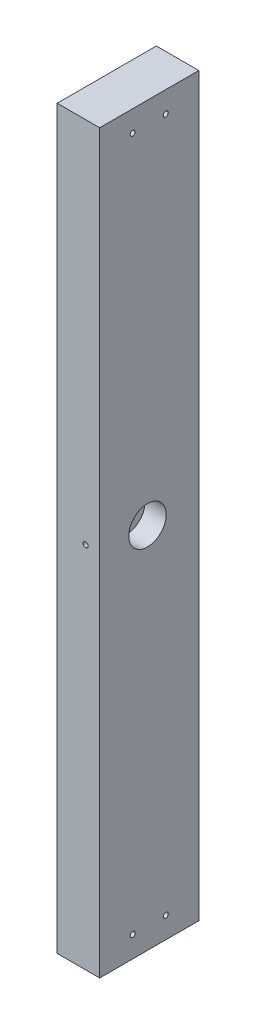
ISO-10303-21;
HEADER;
FILE_DESCRIPTION(('STEP AP214'),'2;1');
FILE_NAME('part.step','',(''),(''),'','','');
FILE_SCHEMA(('AUTOMOTIVE_DESIGN { 1 0 10303 214 1 1 1 1 }'));
ENDSEC;
DATA;
#1=APPLICATION_CONTEXT('core data for automotive mechanical design processes');
#2=APPLICATION_PROTOCOL_DEFINITION('international standard','automotive_design',2000,#1);
#3=PRODUCT_CONTEXT('',#1,'mechanical');
#4=PRODUCT('Part','Part','',(#3));
#5=PRODUCT_RELATED_PRODUCT_CATEGORY('part','',(#4));
#6=PRODUCT_DEFINITION_FORMATION('','',#4);
#7=PRODUCT_DEFINITION_CONTEXT('part definition',#1,'design');
#8=PRODUCT_DEFINITION('design','',#6,#7);
#9=PRODUCT_DEFINITION_SHAPE('','',#8);
#10=(LENGTH_UNIT() NAMED_UNIT(*) SI_UNIT(.MILLI.,.METRE.));
#11=(NAMED_UNIT(*) PLANE_ANGLE_UNIT() SI_UNIT($,.RADIAN.));
#12=(NAMED_UNIT(*) SI_UNIT($,.STERADIAN.) SOLID_ANGLE_UNIT());
#13=UNCERTAINTY_MEASURE_WITH_UNIT(LENGTH_MEASURE(1.E-05),#10,'distance_accuracy_value','');
#14=(GEOMETRIC_REPRESENTATION_CONTEXT(3) GLOBAL_UNCERTAINTY_ASSIGNED_CONTEXT((#13)) GLOBAL_UNIT_ASSIGNED_CONTEXT((#10,
#11,#12)) REPRESENTATION_CONTEXT('',''));
#15=CARTESIAN_POINT('',(0.,0.,0.));
#16=DIRECTION('',(0.,0.,1.));
#17=DIRECTION('',(1.,0.,0.));
#18=AXIS2_PLACEMENT_3D('',#15,#16,#17);
#19=CARTESIAN_POINT('',(0.,660.4,0.));
#20=DIRECTION('',(1.,0.,0.));
#21=DIRECTION('',(0.,0.,-1.));
#22=AXIS2_PLACEMENT_3D('',#19,#20,#21);
#23=PLANE('',#22);
#24=CARTESIAN_POINT('',(0.,19.05,-29.6333333333333));
#25=DIRECTION('',(1.,0.,0.));
#26=DIRECTION('',(0.,0.,-1.));
#27=AXIS2_PLACEMENT_3D('',#24,#25,#26);
#28=CIRCLE('',#27,2.2479);
#29=CARTESIAN_POINT('',(0.,19.05,-31.8812333333333));
#30=VERTEX_POINT('',#29);
#31=EDGE_CURVE('E160',#30,#30,#28,.T.);
#32=ORIENTED_EDGE('',*,*,#31,.T.);
#33=EDGE_LOOP('',(#32));
#34=FACE_BOUND('',#33,.T.);
#35=CARTESIAN_POINT('',(0.,641.35,-59.2666666666667));
#36=DIRECTION('',(1.,0.,0.));
#37=DIRECTION('',(0.,0.,-1.));
#38=AXIS2_PLACEMENT_3D('',#35,#36,#37);
#39=CIRCLE('',#38,2.24790000000002);
#40=CARTESIAN_POINT('',(0.,641.35,-61.5145666666667));
#41=VERTEX_POINT('',#40);
#42=EDGE_CURVE('E164',#41,#41,#39,.T.);
#43=ORIENTED_EDGE('',*,*,#42,.T.);
#44=EDGE_LOOP('',(#43));
#45=FACE_BOUND('',#44,.T.);
#46=CARTESIAN_POINT('',(0.,641.35,-29.6333333333333));
#47=DIRECTION('',(1.,0.,0.));
#48=DIRECTION('',(0.,0.,-1.));
#49=AXIS2_PLACEMENT_3D('',#46,#47,#48);
#50=CIRCLE('',#49,2.24790000000002);
#51=CARTESIAN_POINT('',(0.,641.35,-31.8812333333334));
#52=VERTEX_POINT('',#51);
#53=EDGE_CURVE('E167',#52,#52,#50,.T.);
#54=ORIENTED_EDGE('',*,*,#53,.T.);
#55=EDGE_LOOP('',(#54));
#56=FACE_BOUND('',#55,.T.);
#57=CARTESIAN_POINT('',(0.,19.05,-59.2666666666667));
#58=DIRECTION('',(1.,0.,0.));
#59=DIRECTION('',(0.,0.,-1.));
#60=AXIS2_PLACEMENT_3D('',#57,#58,#59);
#61=CIRCLE('',#60,2.2479);
#62=CARTESIAN_POINT('',(0.,19.05,-61.5145666666667));
#63=VERTEX_POINT('',#62);
#64=EDGE_CURVE('E170',#63,#63,#61,.T.);
#65=ORIENTED_EDGE('',*,*,#64,.T.);
#66=EDGE_LOOP('',(#65));
#67=FACE_BOUND('',#66,.T.);
#68=DIRECTION('',(0.,0.,1.));
#69=VECTOR('',#68,1.);
#70=CARTESIAN_POINT('',(0.,0.,0.));
#71=LINE('',#70,#69);
#72=CARTESIAN_POINT('',(0.,0.,-88.9));
#73=VERTEX_POINT('',#72);
#74=CARTESIAN_POINT('',(0.,0.,0.));
#75=VERTEX_POINT('',#74);
#76=EDGE_CURVE('E96',#73,#75,#71,.T.);
#77=ORIENTED_EDGE('',*,*,#76,.T.);
#78=DIRECTION('',(0.,-1.,0.));
#79=VECTOR('',#78,1.);
#80=CARTESIAN_POINT('',(0.,660.4,0.));
#81=LINE('',#80,#79);
#82=CARTESIAN_POINT('',(0.,660.4,0.));
#83=VERTEX_POINT('',#82);
#84=EDGE_CURVE('E11',#83,#75,#81,.T.);
#85=ORIENTED_EDGE('',*,*,#84,.F.);
#86=DIRECTION('',(0.,0.,1.));
#87=VECTOR('',#86,1.);
#88=CARTESIAN_POINT('',(0.,660.4,0.));
#89=LINE('',#88,#87);
#90=CARTESIAN_POINT('',(0.,660.4,-88.9));
#91=VERTEX_POINT('',#90);
#92=EDGE_CURVE('E84',#91,#83,#89,.T.);
#93=ORIENTED_EDGE('',*,*,#92,.F.);
#94=DIRECTION('',(0.,-1.,0.));
#95=VECTOR('',#94,1.);
#96=CARTESIAN_POINT('',(0.,660.4,-88.9));
#97=LINE('',#96,#95);
#98=EDGE_CURVE('E92',#91,#73,#97,.T.);
#99=ORIENTED_EDGE('',*,*,#98,.T.);
#100=EDGE_LOOP('',(#77,#85,#93,#99));
#101=FACE_BOUND('',#100,.T.);
#102=ADVANCED_FACE('F33',(#34,#45,#56,#67,#101),#23,.F.);
#103=CARTESIAN_POINT('',(0.,660.4,0.));
#104=DIRECTION('',(0.,0.,-1.));
#105=DIRECTION('',(-1.,0.,0.));
#106=AXIS2_PLACEMENT_3D('',#103,#104,#105);
#107=PLANE('',#106);
#108=CARTESIAN_POINT('',(25.4,330.2,0.));
#109=DIRECTION('',(0.,0.,1.));
#110=DIRECTION('',(1.,0.,0.));
#111=AXIS2_PLACEMENT_3D('',#108,#109,#110);
#112=CIRCLE('',#111,2.24789999999999);
#113=CARTESIAN_POINT('',(27.6479,330.2,0.));
#114=VERTEX_POINT('',#113);
#115=EDGE_CURVE('E123',#114,#114,#112,.T.);
#116=ORIENTED_EDGE('',*,*,#115,.F.);
#117=EDGE_LOOP('',(#116));
#118=FACE_BOUND('',#117,.T.);
#119=DIRECTION('',(1.,0.,0.));
#120=VECTOR('',#119,1.);
#121=CARTESIAN_POINT('',(0.,0.,0.));
#122=LINE('',#121,#120);
#123=CARTESIAN_POINT('',(38.1,0.,0.));
#124=VERTEX_POINT('',#123);
#125=EDGE_CURVE('E88',#75,#124,#122,.T.);
#126=ORIENTED_EDGE('',*,*,#125,.T.);
#127=DIRECTION('',(0.,-1.,0.));
#128=VECTOR('',#127,1.);
#129=CARTESIAN_POINT('',(38.1,660.4,0.));
#130=LINE('',#129,#128);
#131=CARTESIAN_POINT('',(38.1,660.4,0.));
#132=VERTEX_POINT('',#131);
#133=EDGE_CURVE('E41',#132,#124,#130,.T.);
#134=ORIENTED_EDGE('',*,*,#133,.F.);
#135=DIRECTION('',(1.,0.,0.));
#136=VECTOR('',#135,1.);
#137=CARTESIAN_POINT('',(0.,660.4,0.));
#138=LINE('',#137,#136);
#139=EDGE_CURVE('E79',#83,#132,#138,.T.);
#140=ORIENTED_EDGE('',*,*,#139,.F.);
#141=ORIENTED_EDGE('',*,*,#84,.T.);
#142=EDGE_LOOP('',(#126,#134,#140,#141));
#143=FACE_BOUND('',#142,.T.);
#144=ADVANCED_FACE('F87',(#118,#143),#107,.F.);
#145=CARTESIAN_POINT('',(38.1,660.4,0.));
#146=DIRECTION('',(-1.,0.,0.));
#147=DIRECTION('',(0.,0.,1.));
#148=AXIS2_PLACEMENT_3D('',#145,#146,#147);
#149=PLANE('',#148);
#150=CARTESIAN_POINT('',(38.1,19.05,-29.6333333333333));
#151=DIRECTION('',(1.,0.,0.));
#152=DIRECTION('',(0.,0.,-1.));
#153=AXIS2_PLACEMENT_3D('',#150,#151,#152);
#154=CIRCLE('',#153,2.2479);
#155=CARTESIAN_POINT('',(38.1,19.05,-31.8812333333333));
#156=VERTEX_POINT('',#155);
#157=EDGE_CURVE('E180',#156,#156,#154,.T.);
#158=ORIENTED_EDGE('',*,*,#157,.F.);
#159=EDGE_LOOP('',(#158));
#160=FACE_BOUND('',#159,.T.);
#161=CARTESIAN_POINT('',(38.1,641.35,-59.2666666666667));
#162=DIRECTION('',(1.,0.,0.));
#163=DIRECTION('',(0.,0.,-1.));
#164=AXIS2_PLACEMENT_3D('',#161,#162,#163);
#165=CIRCLE('',#164,2.24790000000002);
#166=CARTESIAN_POINT('',(38.1,641.35,-61.5145666666667));
#167=VERTEX_POINT('',#166);
#168=EDGE_CURVE('E176',#167,#167,#165,.T.);
#169=ORIENTED_EDGE('',*,*,#168,.F.);
#170=EDGE_LOOP('',(#169));
#171=FACE_BOUND('',#170,.T.);
#172=CARTESIAN_POINT('',(38.1,641.35,-29.6333333333333));
#173=DIRECTION('',(1.,0.,0.));
#174=DIRECTION('',(0.,0.,-1.));
#175=AXIS2_PLACEMENT_3D('',#172,#173,#174);
#176=CIRCLE('',#175,2.24790000000002);
#177=CARTESIAN_POINT('',(38.1,641.35,-31.8812333333334));
#178=VERTEX_POINT('',#177);
#179=EDGE_CURVE('E184',#178,#178,#176,.T.);
#180=ORIENTED_EDGE('',*,*,#179,.F.);
#181=EDGE_LOOP('',(#180));
#182=FACE_BOUND('',#181,.T.);
#183=CARTESIAN_POINT('',(38.1,19.05,-59.2666666666667));
#184=DIRECTION('',(1.,0.,0.));
#185=DIRECTION('',(0.,0.,-1.));
#186=AXIS2_PLACEMENT_3D('',#183,#184,#185);
#187=CIRCLE('',#186,2.2479);
#188=CARTESIAN_POINT('',(38.1,19.05,-61.5145666666667));
#189=VERTEX_POINT('',#188);
#190=EDGE_CURVE('E171',#189,#189,#187,.T.);
#191=ORIENTED_EDGE('',*,*,#190,.F.);
#192=EDGE_LOOP('',(#191));
#193=FACE_BOUND('',#192,.T.);
#194=CARTESIAN_POINT('',(38.1,330.2,-42.8752));
#195=DIRECTION('',(1.,0.,0.));
#196=DIRECTION('',(0.,0.,-1.));
#197=AXIS2_PLACEMENT_3D('',#194,#195,#196);
#198=CIRCLE('',#197,16.8275);
#199=CARTESIAN_POINT('',(38.1,330.2,-59.7027));
#200=VERTEX_POINT('',#199);
#201=EDGE_CURVE('E110',#200,#200,#198,.T.);
#202=ORIENTED_EDGE('',*,*,#201,.F.);
#203=EDGE_LOOP('',(#202));
#204=FACE_BOUND('',#203,.T.);
#205=DIRECTION('',(0.,0.,-1.));
#206=VECTOR('',#205,1.);
#207=CARTESIAN_POINT('',(38.1,0.,0.));
#208=LINE('',#207,#206);
#209=CARTESIAN_POINT('',(38.1,0.,-88.9));
#210=VERTEX_POINT('',#209);
#211=EDGE_CURVE('E66',#124,#210,#208,.T.);
#212=ORIENTED_EDGE('',*,*,#211,.T.);
#213=DIRECTION('',(0.,-1.,0.));
#214=VECTOR('',#213,1.);
#215=CARTESIAN_POINT('',(38.1,660.4,-88.9));
#216=LINE('',#215,#214);
#217=CARTESIAN_POINT('',(38.1,660.4,-88.9));
#218=VERTEX_POINT('',#217);
#219=EDGE_CURVE('E89',#218,#210,#216,.T.);
#220=ORIENTED_EDGE('',*,*,#219,.F.);
#221=DIRECTION('',(0.,0.,-1.));
#222=VECTOR('',#221,1.);
#223=CARTESIAN_POINT('',(38.1,660.4,0.));
#224=LINE('',#223,#222);
#225=EDGE_CURVE('E82',#132,#218,#224,.T.);
#226=ORIENTED_EDGE('',*,*,#225,.F.);
#227=ORIENTED_EDGE('',*,*,#133,.T.);
#228=EDGE_LOOP('',(#212,#220,#226,#227));
#229=FACE_BOUND('',#228,.T.);
#230=ADVANCED_FACE('F90',(#160,#171,#182,#193,#204,#229),#149,.F.);
#231=CARTESIAN_POINT('',(0.,660.4,-88.9));
#232=DIRECTION('',(0.,0.,1.));
#233=DIRECTION('',(1.,0.,0.));
#234=AXIS2_PLACEMENT_3D('',#231,#232,#233);
#235=PLANE('',#234);
#236=DIRECTION('',(-1.,0.,0.));
#237=VECTOR('',#236,1.);
#238=CARTESIAN_POINT('',(0.,0.,-88.9));
#239=LINE('',#238,#237);
#240=EDGE_CURVE('E72',#210,#73,#239,.T.);
#241=ORIENTED_EDGE('',*,*,#240,.T.);
#242=ORIENTED_EDGE('',*,*,#98,.F.);
#243=DIRECTION('',(-1.,0.,0.));
#244=VECTOR('',#243,1.);
#245=CARTESIAN_POINT('',(0.,660.4,-88.9));
#246=LINE('',#245,#244);
#247=EDGE_CURVE('E49',#218,#91,#246,.T.);
#248=ORIENTED_EDGE('',*,*,#247,.F.);
#249=ORIENTED_EDGE('',*,*,#219,.T.);
#250=EDGE_LOOP('',(#241,#242,#248,#249));
#251=FACE_BOUND('',#250,.T.);
#252=ADVANCED_FACE('F104',(#251),#235,.F.);
#253=CARTESIAN_POINT('',(0.,660.4,0.));
#254=DIRECTION('',(0.,-1.,0.));
#255=DIRECTION('',(0.,0.,-1.));
#256=AXIS2_PLACEMENT_3D('',#253,#254,#255);
#257=PLANE('',#256);
#258=ORIENTED_EDGE('',*,*,#92,.T.);
#259=ORIENTED_EDGE('',*,*,#139,.T.);
#260=ORIENTED_EDGE('',*,*,#225,.T.);
#261=ORIENTED_EDGE('',*,*,#247,.T.);
#262=EDGE_LOOP('',(#258,#259,#260,#261));
#263=FACE_BOUND('',#262,.T.);
#264=ADVANCED_FACE('F80',(#263),#257,.F.);
#265=CARTESIAN_POINT('',(0.,0.,0.));
#266=DIRECTION('',(0.,-1.,0.));
#267=DIRECTION('',(0.,0.,-1.));
#268=AXIS2_PLACEMENT_3D('',#265,#266,#267);
#269=PLANE('',#268);
#270=ORIENTED_EDGE('',*,*,#76,.F.);
#271=ORIENTED_EDGE('',*,*,#240,.F.);
#272=ORIENTED_EDGE('',*,*,#211,.F.);
#273=ORIENTED_EDGE('',*,*,#125,.F.);
#274=EDGE_LOOP('',(#270,#271,#272,#273));
#275=FACE_BOUND('',#274,.T.);
#276=ADVANCED_FACE('F107',(#275),#269,.T.);
#277=CARTESIAN_POINT('',(19.05,330.2,-42.8752));
#278=DIRECTION('',(1.,0.,0.));
#279=DIRECTION('',(0.,0.,-1.));
#280=AXIS2_PLACEMENT_3D('',#277,#278,#279);
#281=CYLINDRICAL_SURFACE('',#280,16.8275);
#282=CARTESIAN_POINT('',(27.6479,330.2,-26.0477));
#283=CARTESIAN_POINT('',(27.647894708086,330.074334702401,-26.0477018488571));
#284=CARTESIAN_POINT('',(27.6373267747194,329.948592686172,-26.0491225049798));
#285=CARTESIAN_POINT('',(27.5953389178805,329.700612703813,-26.0546531095101));
#286=CARTESIAN_POINT('',(27.5638976961229,329.578378449901,-26.0587658047087));
#287=CARTESIAN_POINT('',(27.4811104864274,329.341039507401,-26.0692175388866));
#288=CARTESIAN_POINT('',(27.4297784321602,329.225929893267,-26.0755550190965));
#289=CARTESIAN_POINT('',(27.3086983666944,329.005979208235,-26.0897529481188));
#290=CARTESIAN_POINT('',(27.2389533188103,328.901136488741,-26.0976131518161));
#291=CARTESIAN_POINT('',(27.0825613685094,328.704019610955,-26.1140350369292));
#292=CARTESIAN_POINT('',(26.995822229138,328.611818931648,-26.1226003915145));
#293=CARTESIAN_POINT('',(26.8081025448129,328.443236585622,-26.1394378775228));
#294=CARTESIAN_POINT('',(26.7071212456335,328.366855757208,-26.1477099933875));
#295=CARTESIAN_POINT('',(26.4933006930738,328.23180337628,-26.1630603313318));
#296=CARTESIAN_POINT('',(26.3804171065492,328.173201428677,-26.1701338142338));
#297=CARTESIAN_POINT('',(26.1463000803922,328.075814905193,-26.1822369082248));
#298=CARTESIAN_POINT('',(26.0250670019291,328.03702947273,-26.1872666076557));
#299=CARTESIAN_POINT('',(25.7784586052856,327.980601924696,-26.1946771745399));
#300=CARTESIAN_POINT('',(25.6531122942284,327.96283512463,-26.1970736563835));
#301=CARTESIAN_POINT('',(25.401196101719,327.948563213396,-26.1989940889242));
#302=CARTESIAN_POINT('',(25.2746262765052,327.952057129584,-26.1985181710293));
#303=CARTESIAN_POINT('',(25.02472865646,327.980105270609,-26.1947618652881));
#304=CARTESIAN_POINT('',(24.9013850761518,328.004521662238,-26.1914998322861));
#305=CARTESIAN_POINT('',(24.6605616012565,328.073506379214,-26.1825674839979));
#306=CARTESIAN_POINT('',(24.5430818408948,328.118075165624,-26.1768971136122));
#307=CARTESIAN_POINT('',(24.3168954888118,328.226246119556,-26.163766354997));
#308=CARTESIAN_POINT('',(24.2082176435913,328.289907692213,-26.1563003945585));
#309=CARTESIAN_POINT('',(24.003035261181,328.434414667252,-26.1404238897124));
#310=CARTESIAN_POINT('',(23.9065313597689,328.515260966506,-26.1320132960151));
#311=CARTESIAN_POINT('',(23.7276366078709,328.692603987633,-26.1151137437882));
#312=CARTESIAN_POINT('',(23.6453634006657,328.789219419285,-26.1066246915262));
#313=CARTESIAN_POINT('',(23.498183127106,328.994950761053,-26.0905867958908));
#314=CARTESIAN_POINT('',(23.4332761111077,329.104066707416,-26.0830379552438));
#315=CARTESIAN_POINT('',(23.3226686867871,329.331796035648,-26.0697253745184));
#316=CARTESIAN_POINT('',(23.2769761970255,329.450413309214,-26.0639623706641));
#317=CARTESIAN_POINT('',(23.206191119075,329.693731118106,-26.0548772762367));
#318=CARTESIAN_POINT('',(23.1810974284996,329.818431327513,-26.0515550550412));
#319=CARTESIAN_POINT('',(23.1523760197451,330.069358632849,-26.0477429298664));
#320=CARTESIAN_POINT('',(23.1485863483327,330.195566879332,-26.0472316576987));
#321=CARTESIAN_POINT('',(23.162152354956,330.44681845414,-26.0490411904918));
#322=CARTESIAN_POINT('',(23.1795075170717,330.571861810814,-26.0513619263534));
#323=CARTESIAN_POINT('',(23.2347359486478,330.816752106373,-26.0585614471018));
#324=CARTESIAN_POINT('',(23.2725314517975,330.93661689279,-26.063430534407));
#325=CARTESIAN_POINT('',(23.3674864655866,331.168307361374,-26.0751819753137));
#326=CARTESIAN_POINT('',(23.4246467175661,331.28013273557,-26.0820644059906));
#327=CARTESIAN_POINT('',(23.5570966429949,331.493289774734,-26.0971293130405));
#328=CARTESIAN_POINT('',(23.6324904241232,331.594556220012,-26.1053191596169));
#329=CARTESIAN_POINT('',(23.7991207351567,331.783055953834,-26.1220611262931));
#330=CARTESIAN_POINT('',(23.8903579871275,331.870288602441,-26.1306132628907));
#331=CARTESIAN_POINT('',(24.0868012615543,332.028823912303,-26.1471824596885));
#332=CARTESIAN_POINT('',(24.1920946194955,332.100018817902,-26.1551956606703));
#333=CARTESIAN_POINT('',(24.4132400817554,332.223711787851,-26.1697146174096));
#334=CARTESIAN_POINT('',(24.5290919494821,332.276210271016,-26.1762204069333));
#335=CARTESIAN_POINT('',(24.7677266898203,332.360848093023,-26.1869610602185));
#336=CARTESIAN_POINT('',(24.890488169597,332.393046871647,-26.1912025484634));
#337=CARTESIAN_POINT('',(25.1397362407181,332.436362025907,-26.1969528949706));
#338=CARTESIAN_POINT('',(25.2662226316252,332.447479533828,-26.1984618999957));
#339=CARTESIAN_POINT('',(25.5182574327444,332.448293788106,-26.1985717442456));
#340=CARTESIAN_POINT('',(25.6438053192698,332.438159856779,-26.1971955713477));
#341=CARTESIAN_POINT('',(25.8913956645492,332.397118843978,-26.1917397144901));
#342=CARTESIAN_POINT('',(26.0134381246724,332.366211770618,-26.1876600315862));
#343=CARTESIAN_POINT('',(26.2505229638095,332.284557050871,-26.1772642426045));
#344=CARTESIAN_POINT('',(26.3655686158366,332.233818765049,-26.1709491917791));
#345=CARTESIAN_POINT('',(26.5855408713608,332.113958535426,-26.1567926343424));
#346=CARTESIAN_POINT('',(26.6904672772931,332.0448362328,-26.1489510979374));
#347=CARTESIAN_POINT('',(26.888086563867,331.889545906586,-26.1325503844082));
#348=CARTESIAN_POINT('',(26.9806800330145,331.803251893075,-26.1239861898721));
#349=CARTESIAN_POINT('',(27.1501349360914,331.616332396456,-26.1071486673797));
#350=CARTESIAN_POINT('',(27.2269926749106,331.515703556589,-26.0988754081186));
#351=CARTESIAN_POINT('',(27.363083558528,331.302465198421,-26.0835117670663));
#352=CARTESIAN_POINT('',(27.4222388291308,331.189805618369,-26.0764266703912));
#353=CARTESIAN_POINT('',(27.5207039872178,330.956116062333,-26.064290459806));
#354=CARTESIAN_POINT('',(27.5600351141067,330.835095203352,-26.0592371702162));
#355=CARTESIAN_POINT('',(27.6084786598137,330.62789498968,-26.0529313540161));
#356=CARTESIAN_POINT('',(27.6232399880142,330.543013932563,-26.0509793191741));
#357=CARTESIAN_POINT('',(27.642952426827,330.372100572783,-26.048363014734));
#358=CARTESIAN_POINT('',(27.6479036244368,330.286068280335,-26.0476987337161));
#359=CARTESIAN_POINT('',(27.6479,330.2,-26.0477));
#360=B_SPLINE_CURVE_WITH_KNOTS('',3,(#282,#283,#284,#285,#286,#287,#288,#289,#290,#291,#292,
#293,#294,#295,#296,#297,#298,#299,#300,#301,#302,#303,#304,#305,#306,#307,#308,#309,#310,#311,
#312,#313,#314,#315,#316,#317,#318,#319,#320,#321,#322,#323,#324,#325,#326,#327,#328,#329,#330,
#331,#332,#333,#334,#335,#336,#337,#338,#339,#340,#341,#342,#343,#344,#345,#346,#347,#348,#349,
#350,#351,#352,#353,#354,#355,#356,#357,#358,#359),.UNSPECIFIED.,.T.,.F.,(4,2,2,2,2,2,2,2,2,2,2,
2,2,2,2,2,2,2,2,2,2,2,2,2,2,2,2,2,2,2,2,2,2,2,2,2,2,2,4),(0.,0.376681473999343,
0.753747890957645,1.13055064630467,1.50729279743041,1.88613941800602,2.26500610879708,
2.64533748300522,3.02565241574594,3.40369978789962,3.78172986507722,4.15728853273361,
4.53285579315067,4.90960393187584,5.28637173792799,5.66611907826498,6.04586751973326,
6.42577230755262,6.8056567626714,7.18264938878797,7.55963281671695,7.93519197960242,
8.31076552163544,8.68853631365428,9.06632432708379,9.44657958755547,9.82682632947376,
10.2059544315114,10.5850621698204,10.9611608213462,11.3372593259686,11.7131805216422,
12.0891090551897,12.4679048692801,12.8467895315445,13.2273172233318,13.6074363500094,
13.8654281331997,14.1234176284753),.UNSPECIFIED.);
#361=CARTESIAN_POINT('',(27.6479,330.2,-26.0477));
#362=VERTEX_POINT('',#361);
#363=EDGE_CURVE('E113',#362,#362,#360,.T.);
#364=ORIENTED_EDGE('',*,*,#363,.F.);
#365=EDGE_LOOP('',(#364));
#366=FACE_BOUND('',#365,.T.);
#367=CARTESIAN_POINT('',(19.05,330.2,-42.8752));
#368=DIRECTION('',(1.,0.,0.));
#369=DIRECTION('',(0.,0.,-1.));
#370=AXIS2_PLACEMENT_3D('',#367,#368,#369);
#371=CIRCLE('',#370,16.8275);
#372=CARTESIAN_POINT('',(19.05,330.2,-59.7027));
#373=VERTEX_POINT('',#372);
#374=EDGE_CURVE('E99',#373,#373,#371,.T.);
#375=ORIENTED_EDGE('',*,*,#374,.F.);
#376=EDGE_LOOP('',(#375));
#377=FACE_BOUND('',#376,.T.);
#378=ORIENTED_EDGE('',*,*,#201,.T.);
#379=EDGE_LOOP('',(#378));
#380=FACE_BOUND('',#379,.T.);
#381=ADVANCED_FACE('F196',(#366,#377,#380),#281,.F.);
#382=CARTESIAN_POINT('',(19.05,330.2,-42.8752));
#383=DIRECTION('',(1.,0.,0.));
#384=DIRECTION('',(0.,0.,-1.));
#385=AXIS2_PLACEMENT_3D('',#382,#383,#384);
#386=PLANE('',#385);
#387=ORIENTED_EDGE('',*,*,#374,.T.);
#388=EDGE_LOOP('',(#387));
#389=FACE_BOUND('',#388,.T.);
#390=ADVANCED_FACE('F198',(#389),#386,.T.);
#391=CARTESIAN_POINT('',(25.4,330.2,-88.901));
#392=DIRECTION('',(0.,0.,1.));
#393=DIRECTION('',(1.,0.,0.));
#394=AXIS2_PLACEMENT_3D('',#391,#392,#393);
#395=CYLINDRICAL_SURFACE('',#394,2.24789999999999);
#396=ORIENTED_EDGE('',*,*,#363,.T.);
#397=EDGE_LOOP('',(#396));
#398=FACE_BOUND('',#397,.T.);
#399=ORIENTED_EDGE('',*,*,#115,.T.);
#400=EDGE_LOOP('',(#399));
#401=FACE_BOUND('',#400,.T.);
#402=ADVANCED_FACE('F125',(#398,#401),#395,.F.);
#403=CARTESIAN_POINT('',(0.,19.05,-59.2666666666667));
#404=DIRECTION('',(1.,0.,0.));
#405=DIRECTION('',(0.,0.,-1.));
#406=AXIS2_PLACEMENT_3D('',#403,#404,#405);
#407=CYLINDRICAL_SURFACE('',#406,2.2479);
#408=CARTESIAN_POINT('',(0.,19.05,-61.5145666666667));
#409=CARTESIAN_POINT('',(0.396875,19.05,-61.5145666666667));
#410=CARTESIAN_POINT('',(0.79375,19.05,-61.5145666666667));
#411=CARTESIAN_POINT('',(1.5875,19.05,-61.5145666666667));
#412=CARTESIAN_POINT('',(1.984375,19.05,-61.5145666666667));
#413=CARTESIAN_POINT('',(2.778125,19.05,-61.5145666666667));
#414=CARTESIAN_POINT('',(3.175,19.05,-61.5145666666667));
#415=CARTESIAN_POINT('',(3.96875,19.05,-61.5145666666667));
#416=CARTESIAN_POINT('',(4.365625,19.05,-61.5145666666667));
#417=CARTESIAN_POINT('',(5.159375,19.05,-61.5145666666667));
#418=CARTESIAN_POINT('',(5.55625,19.05,-61.5145666666667));
#419=CARTESIAN_POINT('',(6.35,19.05,-61.5145666666667));
#420=CARTESIAN_POINT('',(6.746875,19.05,-61.5145666666667));
#421=CARTESIAN_POINT('',(7.540625,19.05,-61.5145666666667));
#422=CARTESIAN_POINT('',(7.9375,19.05,-61.5145666666667));
#423=CARTESIAN_POINT('',(8.73125,19.05,-61.5145666666667));
#424=CARTESIAN_POINT('',(9.128125,19.05,-61.5145666666667));
#425=CARTESIAN_POINT('',(9.921875,19.05,-61.5145666666667));
#426=CARTESIAN_POINT('',(10.31875,19.05,-61.5145666666667));
#427=CARTESIAN_POINT('',(11.1125,19.05,-61.5145666666667));
#428=CARTESIAN_POINT('',(11.509375,19.05,-61.5145666666667));
#429=CARTESIAN_POINT('',(12.303125,19.05,-61.5145666666667));
#430=CARTESIAN_POINT('',(12.7,19.05,-61.5145666666667));
#431=CARTESIAN_POINT('',(13.49375,19.05,-61.5145666666667));
#432=CARTESIAN_POINT('',(13.890625,19.05,-61.5145666666667));
#433=CARTESIAN_POINT('',(14.684375,19.05,-61.5145666666667));
#434=CARTESIAN_POINT('',(15.08125,19.05,-61.5145666666667));
#435=CARTESIAN_POINT('',(15.875,19.05,-61.5145666666667));
#436=CARTESIAN_POINT('',(16.271875,19.05,-61.5145666666667));
#437=CARTESIAN_POINT('',(17.065625,19.05,-61.5145666666667));
#438=CARTESIAN_POINT('',(17.4625,19.05,-61.5145666666667));
#439=CARTESIAN_POINT('',(18.25625,19.05,-61.5145666666667));
#440=CARTESIAN_POINT('',(18.653125,19.05,-61.5145666666667));
#441=CARTESIAN_POINT('',(19.446875,19.05,-61.5145666666667));
#442=CARTESIAN_POINT('',(19.84375,19.05,-61.5145666666667));
#443=CARTESIAN_POINT('',(20.6375,19.05,-61.5145666666667));
#444=CARTESIAN_POINT('',(21.034375,19.05,-61.5145666666667));
#445=CARTESIAN_POINT('',(21.828125,19.05,-61.5145666666667));
#446=CARTESIAN_POINT('',(22.225,19.05,-61.5145666666667));
#447=CARTESIAN_POINT('',(23.01875,19.05,-61.5145666666667));
#448=CARTESIAN_POINT('',(23.415625,19.05,-61.5145666666667));
#449=CARTESIAN_POINT('',(24.209375,19.05,-61.5145666666667));
#450=CARTESIAN_POINT('',(24.60625,19.05,-61.5145666666667));
#451=CARTESIAN_POINT('',(25.4,19.05,-61.5145666666667));
#452=CARTESIAN_POINT('',(25.796875,19.05,-61.5145666666667));
#453=CARTESIAN_POINT('',(26.590625,19.05,-61.5145666666667));
#454=CARTESIAN_POINT('',(26.9875,19.05,-61.5145666666667));
#455=CARTESIAN_POINT('',(27.78125,19.05,-61.5145666666667));
#456=CARTESIAN_POINT('',(28.178125,19.05,-61.5145666666667));
#457=CARTESIAN_POINT('',(28.971875,19.05,-61.5145666666667));
#458=CARTESIAN_POINT('',(29.36875,19.05,-61.5145666666667));
#459=CARTESIAN_POINT('',(30.1625,19.05,-61.5145666666667));
#460=CARTESIAN_POINT('',(30.559375,19.05,-61.5145666666667));
#461=CARTESIAN_POINT('',(31.353125,19.05,-61.5145666666667));
#462=CARTESIAN_POINT('',(31.75,19.05,-61.5145666666667));
#463=CARTESIAN_POINT('',(32.54375,19.05,-61.5145666666667));
#464=CARTESIAN_POINT('',(32.940625,19.05,-61.5145666666667));
#465=CARTESIAN_POINT('',(33.734375,19.05,-61.5145666666667));
#466=CARTESIAN_POINT('',(34.13125,19.05,-61.5145666666667));
#467=CARTESIAN_POINT('',(34.925,19.05,-61.5145666666667));
#468=CARTESIAN_POINT('',(35.321875,19.05,-61.5145666666667));
#469=CARTESIAN_POINT('',(36.115625,19.05,-61.5145666666667));
#470=CARTESIAN_POINT('',(36.5125,19.05,-61.5145666666667));
#471=CARTESIAN_POINT('',(37.30625,19.05,-61.5145666666667));
#472=CARTESIAN_POINT('',(37.703125,19.05,-61.5145666666667));
#473=CARTESIAN_POINT('',(38.1,19.05,-61.5145666666667));
#474=B_SPLINE_CURVE_WITH_KNOTS('',3,(#408,#409,#410,#411,#412,#413,#414,#415,#416,#417,#418,
#419,#420,#421,#422,#423,#424,#425,#426,#427,#428,#429,#430,#431,#432,#433,#434,#435,#436,#437,
#438,#439,#440,#441,#442,#443,#444,#445,#446,#447,#448,#449,#450,#451,#452,#453,#454,#455,#456,
#457,#458,#459,#460,#461,#462,#463,#464,#465,#466,#467,#468,#469,#470,#471,#472,#473),
.UNSPECIFIED.,.F.,.F.,(4,2,2,2,2,2,2,2,2,2,2,2,2,2,2,2,2,2,2,2,2,2,2,2,2,2,2,2,2,2,2,2,4),(0.,
1.190625,2.38125,3.571875,4.7625,5.953125,7.14375,8.334375,9.525,10.715625,11.90625,13.096875,
14.2875,15.478125,16.66875,17.859375,19.05,20.240625,21.43125,22.621875,23.8125,25.003125,
26.19375,27.384375,28.575,29.765625,30.95625,32.146875,33.3375,34.528125,35.71875,36.909375,
38.1),.UNSPECIFIED.);
#475=EDGE_CURVE('BSEAM130',#63,#189,#474,.T.);
#476=ORIENTED_EDGE('',*,*,#64,.F.);
#477=ORIENTED_EDGE('',*,*,#190,.T.);
#478=ORIENTED_EDGE('',*,*,#475,.T.);
#479=ORIENTED_EDGE('',*,*,#475,.F.);
#480=EDGE_LOOP('',(#476,#478,#477,#479));
#481=FACE_BOUND('',#480,.T.);
#482=ADVANCED_FACE('F130',(#481),#407,.F.);
#483=CARTESIAN_POINT('',(0.,641.35,-29.6333333333333));
#484=DIRECTION('',(1.,0.,0.));
#485=DIRECTION('',(0.,0.,-1.));
#486=AXIS2_PLACEMENT_3D('',#483,#484,#485);
#487=CYLINDRICAL_SURFACE('',#486,2.24790000000002);
#488=CARTESIAN_POINT('',(0.,641.35,-31.8812333333334));
#489=CARTESIAN_POINT('',(0.396875,641.35,-31.8812333333334));
#490=CARTESIAN_POINT('',(0.79375,641.35,-31.8812333333334));
#491=CARTESIAN_POINT('',(1.5875,641.35,-31.8812333333334));
#492=CARTESIAN_POINT('',(1.984375,641.35,-31.8812333333334));
#493=CARTESIAN_POINT('',(2.778125,641.35,-31.8812333333334));
#494=CARTESIAN_POINT('',(3.175,641.35,-31.8812333333334));
#495=CARTESIAN_POINT('',(3.96875,641.35,-31.8812333333334));
#496=CARTESIAN_POINT('',(4.365625,641.35,-31.8812333333334));
#497=CARTESIAN_POINT('',(5.159375,641.35,-31.8812333333334));
#498=CARTESIAN_POINT('',(5.55625,641.35,-31.8812333333334));
#499=CARTESIAN_POINT('',(6.35,641.35,-31.8812333333334));
#500=CARTESIAN_POINT('',(6.746875,641.35,-31.8812333333334));
#501=CARTESIAN_POINT('',(7.540625,641.35,-31.8812333333334));
#502=CARTESIAN_POINT('',(7.9375,641.35,-31.8812333333334));
#503=CARTESIAN_POINT('',(8.73125,641.35,-31.8812333333334));
#504=CARTESIAN_POINT('',(9.128125,641.35,-31.8812333333334));
#505=CARTESIAN_POINT('',(9.921875,641.35,-31.8812333333334));
#506=CARTESIAN_POINT('',(10.31875,641.35,-31.8812333333334));
#507=CARTESIAN_POINT('',(11.1125,641.35,-31.8812333333334));
#508=CARTESIAN_POINT('',(11.509375,641.35,-31.8812333333334));
#509=CARTESIAN_POINT('',(12.303125,641.35,-31.8812333333334));
#510=CARTESIAN_POINT('',(12.7,641.35,-31.8812333333334));
#511=CARTESIAN_POINT('',(13.49375,641.35,-31.8812333333334));
#512=CARTESIAN_POINT('',(13.890625,641.35,-31.8812333333334));
#513=CARTESIAN_POINT('',(14.684375,641.35,-31.8812333333334));
#514=CARTESIAN_POINT('',(15.08125,641.35,-31.8812333333334));
#515=CARTESIAN_POINT('',(15.875,641.35,-31.8812333333334));
#516=CARTESIAN_POINT('',(16.271875,641.35,-31.8812333333334));
#517=CARTESIAN_POINT('',(17.065625,641.35,-31.8812333333334));
#518=CARTESIAN_POINT('',(17.4625,641.35,-31.8812333333334));
#519=CARTESIAN_POINT('',(18.25625,641.35,-31.8812333333334));
#520=CARTESIAN_POINT('',(18.653125,641.35,-31.8812333333334));
#521=CARTESIAN_POINT('',(19.446875,641.35,-31.8812333333334));
#522=CARTESIAN_POINT('',(19.84375,641.35,-31.8812333333334));
#523=CARTESIAN_POINT('',(20.6375,641.35,-31.8812333333334));
#524=CARTESIAN_POINT('',(21.034375,641.35,-31.8812333333334));
#525=CARTESIAN_POINT('',(21.828125,641.35,-31.8812333333334));
#526=CARTESIAN_POINT('',(22.225,641.35,-31.8812333333334));
#527=CARTESIAN_POINT('',(23.01875,641.35,-31.8812333333334));
#528=CARTESIAN_POINT('',(23.415625,641.35,-31.8812333333334));
#529=CARTESIAN_POINT('',(24.209375,641.35,-31.8812333333334));
#530=CARTESIAN_POINT('',(24.60625,641.35,-31.8812333333334));
#531=CARTESIAN_POINT('',(25.4,641.35,-31.8812333333334));
#532=CARTESIAN_POINT('',(25.796875,641.35,-31.8812333333334));
#533=CARTESIAN_POINT('',(26.590625,641.35,-31.8812333333334));
#534=CARTESIAN_POINT('',(26.9875,641.35,-31.8812333333334));
#535=CARTESIAN_POINT('',(27.78125,641.35,-31.8812333333334));
#536=CARTESIAN_POINT('',(28.178125,641.35,-31.8812333333334));
#537=CARTESIAN_POINT('',(28.971875,641.35,-31.8812333333334));
#538=CARTESIAN_POINT('',(29.36875,641.35,-31.8812333333334));
#539=CARTESIAN_POINT('',(30.1625,641.35,-31.8812333333334));
#540=CARTESIAN_POINT('',(30.559375,641.35,-31.8812333333334));
#541=CARTESIAN_POINT('',(31.353125,641.35,-31.8812333333334));
#542=CARTESIAN_POINT('',(31.75,641.35,-31.8812333333334));
#543=CARTESIAN_POINT('',(32.54375,641.35,-31.8812333333334));
#544=CARTESIAN_POINT('',(32.940625,641.35,-31.8812333333334));
#545=CARTESIAN_POINT('',(33.734375,641.35,-31.8812333333334));
#546=CARTESIAN_POINT('',(34.13125,641.35,-31.8812333333334));
#547=CARTESIAN_POINT('',(34.925,641.35,-31.8812333333334));
#548=CARTESIAN_POINT('',(35.321875,641.35,-31.8812333333334));
#549=CARTESIAN_POINT('',(36.115625,641.35,-31.8812333333334));
#550=CARTESIAN_POINT('',(36.5125,641.35,-31.8812333333334));
#551=CARTESIAN_POINT('',(37.30625,641.35,-31.8812333333334));
#552=CARTESIAN_POINT('',(37.703125,641.35,-31.8812333333334));
#553=CARTESIAN_POINT('',(38.1,641.35,-31.8812333333334));
#554=B_SPLINE_CURVE_WITH_KNOTS('',3,(#488,#489,#490,#491,#492,#493,#494,#495,#496,#497,#498,
#499,#500,#501,#502,#503,#504,#505,#506,#507,#508,#509,#510,#511,#512,#513,#514,#515,#516,#517,
#518,#519,#520,#521,#522,#523,#524,#525,#526,#527,#528,#529,#530,#531,#532,#533,#534,#535,#536,
#537,#538,#539,#540,#541,#542,#543,#544,#545,#546,#547,#548,#549,#550,#551,#552,#553),
.UNSPECIFIED.,.F.,.F.,(4,2,2,2,2,2,2,2,2,2,2,2,2,2,2,2,2,2,2,2,2,2,2,2,2,2,2,2,2,2,2,2,4),(0.,
1.190625,2.38125,3.571875,4.7625,5.953125,7.14375,8.334375,9.525,10.715625,11.90625,13.096875,
14.2875,15.478125,16.66875,17.859375,19.05,20.240625,21.43125,22.621875,23.8125,25.003125,
26.19375,27.384375,28.575,29.765625,30.95625,32.146875,33.3375,34.528125,35.71875,36.909375,
38.1),.UNSPECIFIED.);
#555=EDGE_CURVE('BSEAM133',#52,#178,#554,.T.);
#556=ORIENTED_EDGE('',*,*,#53,.F.);
#557=ORIENTED_EDGE('',*,*,#179,.T.);
#558=ORIENTED_EDGE('',*,*,#555,.T.);
#559=ORIENTED_EDGE('',*,*,#555,.F.);
#560=EDGE_LOOP('',(#556,#558,#557,#559));
#561=FACE_BOUND('',#560,.T.);
#562=ADVANCED_FACE('F133',(#561),#487,.F.);
#563=CARTESIAN_POINT('',(0.,641.35,-59.2666666666667));
#564=DIRECTION('',(1.,0.,0.));
#565=DIRECTION('',(0.,0.,-1.));
#566=AXIS2_PLACEMENT_3D('',#563,#564,#565);
#567=CYLINDRICAL_SURFACE('',#566,2.24790000000002);
#568=CARTESIAN_POINT('',(0.,641.35,-61.5145666666667));
#569=CARTESIAN_POINT('',(0.396875,641.35,-61.5145666666667));
#570=CARTESIAN_POINT('',(0.79375,641.35,-61.5145666666667));
#571=CARTESIAN_POINT('',(1.5875,641.35,-61.5145666666667));
#572=CARTESIAN_POINT('',(1.984375,641.35,-61.5145666666667));
#573=CARTESIAN_POINT('',(2.778125,641.35,-61.5145666666667));
#574=CARTESIAN_POINT('',(3.175,641.35,-61.5145666666667));
#575=CARTESIAN_POINT('',(3.96875,641.35,-61.5145666666667));
#576=CARTESIAN_POINT('',(4.365625,641.35,-61.5145666666667));
#577=CARTESIAN_POINT('',(5.159375,641.35,-61.5145666666667));
#578=CARTESIAN_POINT('',(5.55625,641.35,-61.5145666666667));
#579=CARTESIAN_POINT('',(6.35,641.35,-61.5145666666667));
#580=CARTESIAN_POINT('',(6.746875,641.35,-61.5145666666667));
#581=CARTESIAN_POINT('',(7.540625,641.35,-61.5145666666667));
#582=CARTESIAN_POINT('',(7.9375,641.35,-61.5145666666667));
#583=CARTESIAN_POINT('',(8.73125,641.35,-61.5145666666667));
#584=CARTESIAN_POINT('',(9.128125,641.35,-61.5145666666667));
#585=CARTESIAN_POINT('',(9.921875,641.35,-61.5145666666667));
#586=CARTESIAN_POINT('',(10.31875,641.35,-61.5145666666667));
#587=CARTESIAN_POINT('',(11.1125,641.35,-61.5145666666667));
#588=CARTESIAN_POINT('',(11.509375,641.35,-61.5145666666667));
#589=CARTESIAN_POINT('',(12.303125,641.35,-61.5145666666667));
#590=CARTESIAN_POINT('',(12.7,641.35,-61.5145666666667));
#591=CARTESIAN_POINT('',(13.49375,641.35,-61.5145666666667));
#592=CARTESIAN_POINT('',(13.890625,641.35,-61.5145666666667));
#593=CARTESIAN_POINT('',(14.684375,641.35,-61.5145666666667));
#594=CARTESIAN_POINT('',(15.08125,641.35,-61.5145666666667));
#595=CARTESIAN_POINT('',(15.875,641.35,-61.5145666666667));
#596=CARTESIAN_POINT('',(16.271875,641.35,-61.5145666666667));
#597=CARTESIAN_POINT('',(17.065625,641.35,-61.5145666666667));
#598=CARTESIAN_POINT('',(17.4625,641.35,-61.5145666666667));
#599=CARTESIAN_POINT('',(18.25625,641.35,-61.5145666666667));
#600=CARTESIAN_POINT('',(18.653125,641.35,-61.5145666666667));
#601=CARTESIAN_POINT('',(19.446875,641.35,-61.5145666666667));
#602=CARTESIAN_POINT('',(19.84375,641.35,-61.5145666666667));
#603=CARTESIAN_POINT('',(20.6375,641.35,-61.5145666666667));
#604=CARTESIAN_POINT('',(21.034375,641.35,-61.5145666666667));
#605=CARTESIAN_POINT('',(21.828125,641.35,-61.5145666666667));
#606=CARTESIAN_POINT('',(22.225,641.35,-61.5145666666667));
#607=CARTESIAN_POINT('',(23.01875,641.35,-61.5145666666667));
#608=CARTESIAN_POINT('',(23.415625,641.35,-61.5145666666667));
#609=CARTESIAN_POINT('',(24.209375,641.35,-61.5145666666667));
#610=CARTESIAN_POINT('',(24.60625,641.35,-61.5145666666667));
#611=CARTESIAN_POINT('',(25.4,641.35,-61.5145666666667));
#612=CARTESIAN_POINT('',(25.796875,641.35,-61.5145666666667));
#613=CARTESIAN_POINT('',(26.590625,641.35,-61.5145666666667));
#614=CARTESIAN_POINT('',(26.9875,641.35,-61.5145666666667));
#615=CARTESIAN_POINT('',(27.78125,641.35,-61.5145666666667));
#616=CARTESIAN_POINT('',(28.178125,641.35,-61.5145666666667));
#617=CARTESIAN_POINT('',(28.971875,641.35,-61.5145666666667));
#618=CARTESIAN_POINT('',(29.36875,641.35,-61.5145666666667));
#619=CARTESIAN_POINT('',(30.1625,641.35,-61.5145666666667));
#620=CARTESIAN_POINT('',(30.559375,641.35,-61.5145666666667));
#621=CARTESIAN_POINT('',(31.353125,641.35,-61.5145666666667));
#622=CARTESIAN_POINT('',(31.75,641.35,-61.5145666666667));
#623=CARTESIAN_POINT('',(32.54375,641.35,-61.5145666666667));
#624=CARTESIAN_POINT('',(32.940625,641.35,-61.5145666666667));
#625=CARTESIAN_POINT('',(33.734375,641.35,-61.5145666666667));
#626=CARTESIAN_POINT('',(34.13125,641.35,-61.5145666666667));
#627=CARTESIAN_POINT('',(34.925,641.35,-61.5145666666667));
#628=CARTESIAN_POINT('',(35.321875,641.35,-61.5145666666667));
#629=CARTESIAN_POINT('',(36.115625,641.35,-61.5145666666667));
#630=CARTESIAN_POINT('',(36.5125,641.35,-61.5145666666667));
#631=CARTESIAN_POINT('',(37.30625,641.35,-61.5145666666667));
#632=CARTESIAN_POINT('',(37.703125,641.35,-61.5145666666667));
#633=CARTESIAN_POINT('',(38.1,641.35,-61.5145666666667));
#634=B_SPLINE_CURVE_WITH_KNOTS('',3,(#568,#569,#570,#571,#572,#573,#574,#575,#576,#577,#578,
#579,#580,#581,#582,#583,#584,#585,#586,#587,#588,#589,#590,#591,#592,#593,#594,#595,#596,#597,
#598,#599,#600,#601,#602,#603,#604,#605,#606,#607,#608,#609,#610,#611,#612,#613,#614,#615,#616,
#617,#618,#619,#620,#621,#622,#623,#624,#625,#626,#627,#628,#629,#630,#631,#632,#633),
.UNSPECIFIED.,.F.,.F.,(4,2,2,2,2,2,2,2,2,2,2,2,2,2,2,2,2,2,2,2,2,2,2,2,2,2,2,2,2,2,2,2,4),(0.,
1.190625,2.38125,3.571875,4.7625,5.953125,7.14375,8.334375,9.525,10.715625,11.90625,13.096875,
14.2875,15.478125,16.66875,17.859375,19.05,20.240625,21.43125,22.621875,23.8125,25.003125,
26.19375,27.384375,28.575,29.765625,30.95625,32.146875,33.3375,34.528125,35.71875,36.909375,
38.1),.UNSPECIFIED.);
#635=EDGE_CURVE('BSEAM135',#41,#167,#634,.T.);
#636=ORIENTED_EDGE('',*,*,#42,.F.);
#637=ORIENTED_EDGE('',*,*,#168,.T.);
#638=ORIENTED_EDGE('',*,*,#635,.T.);
#639=ORIENTED_EDGE('',*,*,#635,.F.);
#640=EDGE_LOOP('',(#636,#638,#637,#639));
#641=FACE_BOUND('',#640,.T.);
#642=ADVANCED_FACE('F135',(#641),#567,.F.);
#643=CARTESIAN_POINT('',(0.,19.05,-29.6333333333333));
#644=DIRECTION('',(1.,0.,0.));
#645=DIRECTION('',(0.,0.,-1.));
#646=AXIS2_PLACEMENT_3D('',#643,#644,#645);
#647=CYLINDRICAL_SURFACE('',#646,2.2479);
#648=CARTESIAN_POINT('',(0.,19.05,-31.8812333333333));
#649=CARTESIAN_POINT('',(0.396875,19.05,-31.8812333333333));
#650=CARTESIAN_POINT('',(0.79375,19.05,-31.8812333333333));
#651=CARTESIAN_POINT('',(1.5875,19.05,-31.8812333333333));
#652=CARTESIAN_POINT('',(1.984375,19.05,-31.8812333333333));
#653=CARTESIAN_POINT('',(2.778125,19.05,-31.8812333333333));
#654=CARTESIAN_POINT('',(3.175,19.05,-31.8812333333333));
#655=CARTESIAN_POINT('',(3.96875,19.05,-31.8812333333333));
#656=CARTESIAN_POINT('',(4.365625,19.05,-31.8812333333333));
#657=CARTESIAN_POINT('',(5.159375,19.05,-31.8812333333333));
#658=CARTESIAN_POINT('',(5.55625,19.05,-31.8812333333333));
#659=CARTESIAN_POINT('',(6.35,19.05,-31.8812333333333));
#660=CARTESIAN_POINT('',(6.746875,19.05,-31.8812333333333));
#661=CARTESIAN_POINT('',(7.540625,19.05,-31.8812333333333));
#662=CARTESIAN_POINT('',(7.9375,19.05,-31.8812333333333));
#663=CARTESIAN_POINT('',(8.73125,19.05,-31.8812333333333));
#664=CARTESIAN_POINT('',(9.128125,19.05,-31.8812333333333));
#665=CARTESIAN_POINT('',(9.921875,19.05,-31.8812333333333));
#666=CARTESIAN_POINT('',(10.31875,19.05,-31.8812333333333));
#667=CARTESIAN_POINT('',(11.1125,19.05,-31.8812333333333));
#668=CARTESIAN_POINT('',(11.509375,19.05,-31.8812333333333));
#669=CARTESIAN_POINT('',(12.303125,19.05,-31.8812333333333));
#670=CARTESIAN_POINT('',(12.7,19.05,-31.8812333333333));
#671=CARTESIAN_POINT('',(13.49375,19.05,-31.8812333333333));
#672=CARTESIAN_POINT('',(13.890625,19.05,-31.8812333333333));
#673=CARTESIAN_POINT('',(14.684375,19.05,-31.8812333333333));
#674=CARTESIAN_POINT('',(15.08125,19.05,-31.8812333333333));
#675=CARTESIAN_POINT('',(15.875,19.05,-31.8812333333333));
#676=CARTESIAN_POINT('',(16.271875,19.05,-31.8812333333333));
#677=CARTESIAN_POINT('',(17.065625,19.05,-31.8812333333333));
#678=CARTESIAN_POINT('',(17.4625,19.05,-31.8812333333333));
#679=CARTESIAN_POINT('',(18.25625,19.05,-31.8812333333333));
#680=CARTESIAN_POINT('',(18.653125,19.05,-31.8812333333333));
#681=CARTESIAN_POINT('',(19.446875,19.05,-31.8812333333333));
#682=CARTESIAN_POINT('',(19.84375,19.05,-31.8812333333333));
#683=CARTESIAN_POINT('',(20.6375,19.05,-31.8812333333333));
#684=CARTESIAN_POINT('',(21.034375,19.05,-31.8812333333333));
#685=CARTESIAN_POINT('',(21.828125,19.05,-31.8812333333333));
#686=CARTESIAN_POINT('',(22.225,19.05,-31.8812333333333));
#687=CARTESIAN_POINT('',(23.01875,19.05,-31.8812333333333));
#688=CARTESIAN_POINT('',(23.415625,19.05,-31.8812333333333));
#689=CARTESIAN_POINT('',(24.209375,19.05,-31.8812333333333));
#690=CARTESIAN_POINT('',(24.60625,19.05,-31.8812333333333));
#691=CARTESIAN_POINT('',(25.4,19.05,-31.8812333333333));
#692=CARTESIAN_POINT('',(25.796875,19.05,-31.8812333333333));
#693=CARTESIAN_POINT('',(26.590625,19.05,-31.8812333333333));
#694=CARTESIAN_POINT('',(26.9875,19.05,-31.8812333333333));
#695=CARTESIAN_POINT('',(27.78125,19.05,-31.8812333333333));
#696=CARTESIAN_POINT('',(28.178125,19.05,-31.8812333333333));
#697=CARTESIAN_POINT('',(28.971875,19.05,-31.8812333333333));
#698=CARTESIAN_POINT('',(29.36875,19.05,-31.8812333333333));
#699=CARTESIAN_POINT('',(30.1625,19.05,-31.8812333333333));
#700=CARTESIAN_POINT('',(30.559375,19.05,-31.8812333333333));
#701=CARTESIAN_POINT('',(31.353125,19.05,-31.8812333333333));
#702=CARTESIAN_POINT('',(31.75,19.05,-31.8812333333333));
#703=CARTESIAN_POINT('',(32.54375,19.05,-31.8812333333333));
#704=CARTESIAN_POINT('',(32.940625,19.05,-31.8812333333333));
#705=CARTESIAN_POINT('',(33.734375,19.05,-31.8812333333333));
#706=CARTESIAN_POINT('',(34.13125,19.05,-31.8812333333333));
#707=CARTESIAN_POINT('',(34.925,19.05,-31.8812333333333));
#708=CARTESIAN_POINT('',(35.321875,19.05,-31.8812333333333));
#709=CARTESIAN_POINT('',(36.115625,19.05,-31.8812333333333));
#710=CARTESIAN_POINT('',(36.5125,19.05,-31.8812333333333));
#711=CARTESIAN_POINT('',(37.30625,19.05,-31.8812333333333));
#712=CARTESIAN_POINT('',(37.703125,19.05,-31.8812333333333));
#713=CARTESIAN_POINT('',(38.1,19.05,-31.8812333333333));
#714=B_SPLINE_CURVE_WITH_KNOTS('',3,(#648,#649,#650,#651,#652,#653,#654,#655,#656,#657,#658,
#659,#660,#661,#662,#663,#664,#665,#666,#667,#668,#669,#670,#671,#672,#673,#674,#675,#676,#677,
#678,#679,#680,#681,#682,#683,#684,#685,#686,#687,#688,#689,#690,#691,#692,#693,#694,#695,#696,
#697,#698,#699,#700,#701,#702,#703,#704,#705,#706,#707,#708,#709,#710,#711,#712,#713),
.UNSPECIFIED.,.F.,.F.,(4,2,2,2,2,2,2,2,2,2,2,2,2,2,2,2,2,2,2,2,2,2,2,2,2,2,2,2,2,2,2,2,4),(0.,
1.190625,2.38125,3.571875,4.7625,5.953125,7.14375,8.334375,9.525,10.715625,11.90625,13.096875,
14.2875,15.478125,16.66875,17.859375,19.05,20.240625,21.43125,22.621875,23.8125,25.003125,
26.19375,27.384375,28.575,29.765625,30.95625,32.146875,33.3375,34.528125,35.71875,36.909375,
38.1),.UNSPECIFIED.);
#715=EDGE_CURVE('BSEAM138',#30,#156,#714,.T.);
#716=ORIENTED_EDGE('',*,*,#31,.F.);
#717=ORIENTED_EDGE('',*,*,#157,.T.);
#718=ORIENTED_EDGE('',*,*,#715,.T.);
#719=ORIENTED_EDGE('',*,*,#715,.F.);
#720=EDGE_LOOP('',(#716,#718,#717,#719));
#721=FACE_BOUND('',#720,.T.);
#722=ADVANCED_FACE('F138',(#721),#647,.F.);
#723=CLOSED_SHELL('',(#102,#144,#230,#252,#264,#276,#381,#390,#402,#482,#562,#642,#722));
#724=MANIFOLD_SOLID_BREP('B2',#723);
#725=ADVANCED_BREP_SHAPE_REPRESENTATION('',(#18,#724),#14);
#726=SHAPE_DEFINITION_REPRESENTATION(#9,#725);
ENDSEC;
END-ISO-10303-21;
